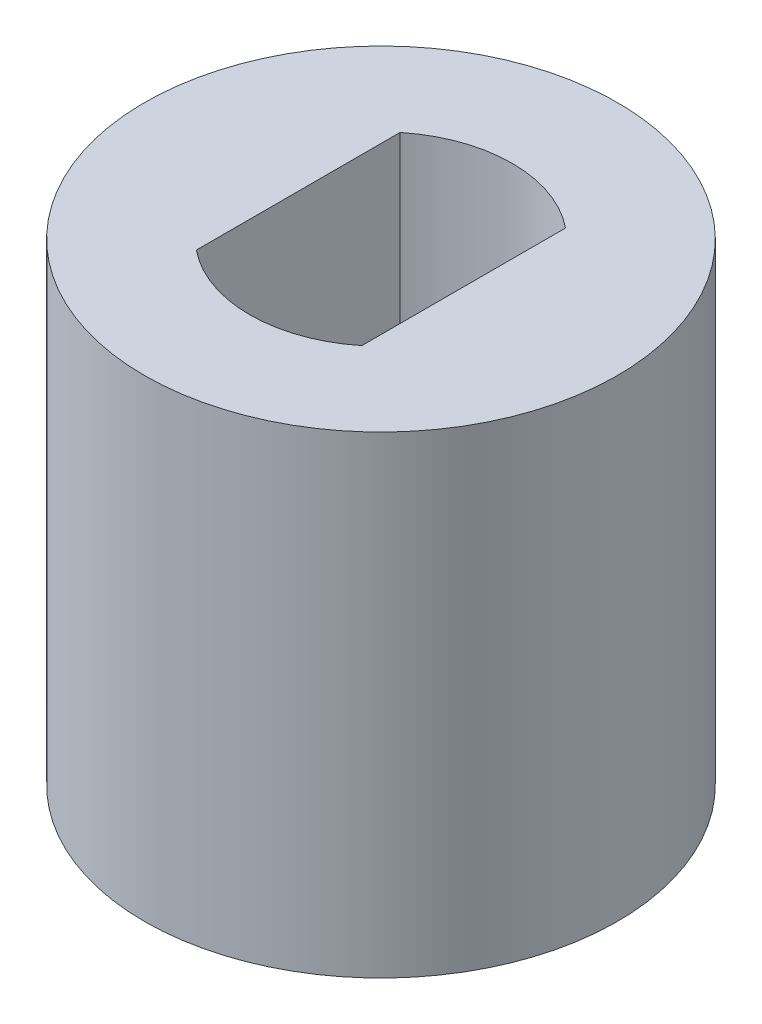
ISO-10303-21;
HEADER;
FILE_DESCRIPTION(('STEP AP214'),'2;1');
FILE_NAME('part.step','',(''),(''),'','','');
FILE_SCHEMA(('AUTOMOTIVE_DESIGN { 1 0 10303 214 1 1 1 1 }'));
ENDSEC;
DATA;
#1=APPLICATION_CONTEXT('core data for automotive mechanical design processes');
#2=APPLICATION_PROTOCOL_DEFINITION('international standard','automotive_design',2000,#1);
#3=PRODUCT_CONTEXT('',#1,'mechanical');
#4=PRODUCT('Part','Part','',(#3));
#5=PRODUCT_RELATED_PRODUCT_CATEGORY('part','',(#4));
#6=PRODUCT_DEFINITION_FORMATION('','',#4);
#7=PRODUCT_DEFINITION_CONTEXT('part definition',#1,'design');
#8=PRODUCT_DEFINITION('design','',#6,#7);
#9=PRODUCT_DEFINITION_SHAPE('','',#8);
#10=(LENGTH_UNIT() NAMED_UNIT(*) SI_UNIT(.MILLI.,.METRE.));
#11=(NAMED_UNIT(*) PLANE_ANGLE_UNIT() SI_UNIT($,.RADIAN.));
#12=(NAMED_UNIT(*) SI_UNIT($,.STERADIAN.) SOLID_ANGLE_UNIT());
#13=UNCERTAINTY_MEASURE_WITH_UNIT(LENGTH_MEASURE(1.E-05),#10,'distance_accuracy_value','');
#14=(GEOMETRIC_REPRESENTATION_CONTEXT(3) GLOBAL_UNCERTAINTY_ASSIGNED_CONTEXT((#13)) GLOBAL_UNIT_ASSIGNED_CONTEXT((#10,
#11,#12)) REPRESENTATION_CONTEXT('',''));
#15=CARTESIAN_POINT('',(0.,0.,0.));
#16=DIRECTION('',(0.,0.,1.));
#17=DIRECTION('',(1.,0.,0.));
#18=AXIS2_PLACEMENT_3D('',#15,#16,#17);
#19=CARTESIAN_POINT('',(0.,10.,0.));
#20=DIRECTION('',(0.,1.,0.));
#21=DIRECTION('',(0.,0.,1.));
#22=AXIS2_PLACEMENT_3D('',#19,#20,#21);
#23=PLANE('',#22);
#24=CARTESIAN_POINT('',(0.,10.,0.));
#25=DIRECTION('',(0.,1.,0.));
#26=DIRECTION('',(0.,0.,1.));
#27=AXIS2_PLACEMENT_3D('',#24,#25,#26);
#28=CIRCLE('',#27,5.);
#29=CARTESIAN_POINT('',(0.,10.,5.));
#30=VERTEX_POINT('',#29);
#31=EDGE_CURVE('E11',#30,#30,#28,.T.);
#32=ORIENTED_EDGE('',*,*,#31,.T.);
#33=EDGE_LOOP('',(#32));
#34=FACE_BOUND('',#33,.T.);
#35=DIRECTION('',(0.,0.,1.));
#36=VECTOR('',#35,1.);
#37=CARTESIAN_POINT('',(-1.75,10.,-2.15363065542818));
#38=LINE('',#37,#36);
#39=CARTESIAN_POINT('',(-1.75,10.,-2.15363065542818));
#40=VERTEX_POINT('',#39);
#41=CARTESIAN_POINT('',(-1.75,10.,2.15363065542818));
#42=VERTEX_POINT('',#41);
#43=EDGE_CURVE('E90',#40,#42,#38,.T.);
#44=ORIENTED_EDGE('',*,*,#43,.F.);
#45=CARTESIAN_POINT('',(0.,10.,0.));
#46=DIRECTION('',(0.,1.,0.));
#47=DIRECTION('',(0.,0.,1.));
#48=AXIS2_PLACEMENT_3D('',#45,#46,#47);
#49=CIRCLE('',#48,2.775);
#50=CARTESIAN_POINT('',(1.75,10.,-2.15363065542818));
#51=VERTEX_POINT('',#50);
#52=EDGE_CURVE('E81',#51,#40,#49,.T.);
#53=ORIENTED_EDGE('',*,*,#52,.F.);
#54=DIRECTION('',(0.,0.,-1.));
#55=VECTOR('',#54,1.);
#56=CARTESIAN_POINT('',(1.75,10.,-2.15363065542818));
#57=LINE('',#56,#55);
#58=CARTESIAN_POINT('',(1.75,10.,2.15363065542818));
#59=VERTEX_POINT('',#58);
#60=EDGE_CURVE('E106',#59,#51,#57,.T.);
#61=ORIENTED_EDGE('',*,*,#60,.F.);
#62=CARTESIAN_POINT('',(0.,10.,0.));
#63=DIRECTION('',(0.,1.,0.));
#64=DIRECTION('',(0.,0.,1.));
#65=AXIS2_PLACEMENT_3D('',#62,#63,#64);
#66=CIRCLE('',#65,2.775);
#67=EDGE_CURVE('E102',#42,#59,#66,.T.);
#68=ORIENTED_EDGE('',*,*,#67,.F.);
#69=EDGE_LOOP('',(#44,#53,#61,#68));
#70=FACE_BOUND('',#69,.T.);
#71=ADVANCED_FACE('F39',(#34,#70),#23,.T.);
#72=CARTESIAN_POINT('',(0.,0.,0.));
#73=DIRECTION('',(0.,1.,0.));
#74=DIRECTION('',(0.,0.,1.));
#75=AXIS2_PLACEMENT_3D('',#72,#73,#74);
#76=PLANE('',#75);
#77=CARTESIAN_POINT('',(0.,0.,0.));
#78=DIRECTION('',(0.,1.,0.));
#79=DIRECTION('',(0.,0.,1.));
#80=AXIS2_PLACEMENT_3D('',#77,#78,#79);
#81=CIRCLE('',#80,5.);
#82=CARTESIAN_POINT('',(0.,0.,5.));
#83=VERTEX_POINT('',#82);
#84=EDGE_CURVE('E43',#83,#83,#81,.T.);
#85=ORIENTED_EDGE('',*,*,#84,.F.);
#86=EDGE_LOOP('',(#85));
#87=FACE_BOUND('',#86,.T.);
#88=CARTESIAN_POINT('',(0.,0.,0.));
#89=DIRECTION('',(0.,1.,0.));
#90=DIRECTION('',(0.,0.,1.));
#91=AXIS2_PLACEMENT_3D('',#88,#89,#90);
#92=CIRCLE('',#91,2.775);
#93=CARTESIAN_POINT('',(1.75,0.,-2.15363065542818));
#94=VERTEX_POINT('',#93);
#95=CARTESIAN_POINT('',(-1.75,0.,-2.15363065542818));
#96=VERTEX_POINT('',#95);
#97=EDGE_CURVE('E63',#94,#96,#92,.T.);
#98=ORIENTED_EDGE('',*,*,#97,.T.);
#99=DIRECTION('',(0.,0.,1.));
#100=VECTOR('',#99,1.);
#101=CARTESIAN_POINT('',(-1.75,0.,-2.15363065542818));
#102=LINE('',#101,#100);
#103=CARTESIAN_POINT('',(-1.75,0.,2.15363065542818));
#104=VERTEX_POINT('',#103);
#105=EDGE_CURVE('E97',#96,#104,#102,.T.);
#106=ORIENTED_EDGE('',*,*,#105,.T.);
#107=CARTESIAN_POINT('',(0.,0.,0.));
#108=DIRECTION('',(0.,1.,0.));
#109=DIRECTION('',(0.,0.,1.));
#110=AXIS2_PLACEMENT_3D('',#107,#108,#109);
#111=CIRCLE('',#110,2.775);
#112=CARTESIAN_POINT('',(1.75,0.,2.15363065542818));
#113=VERTEX_POINT('',#112);
#114=EDGE_CURVE('E115',#104,#113,#111,.T.);
#115=ORIENTED_EDGE('',*,*,#114,.T.);
#116=DIRECTION('',(0.,0.,-1.));
#117=VECTOR('',#116,1.);
#118=CARTESIAN_POINT('',(1.75,0.,-2.15363065542818));
#119=LINE('',#118,#117);
#120=EDGE_CURVE('E91',#113,#94,#119,.T.);
#121=ORIENTED_EDGE('',*,*,#120,.T.);
#122=EDGE_LOOP('',(#98,#106,#115,#121));
#123=FACE_BOUND('',#122,.T.);
#124=ADVANCED_FACE('F131',(#87,#123),#76,.F.);
#125=CARTESIAN_POINT('',(0.,10.,0.));
#126=DIRECTION('',(0.,-1.,0.));
#127=DIRECTION('',(0.,0.,-1.));
#128=AXIS2_PLACEMENT_3D('',#125,#126,#127);
#129=CYLINDRICAL_SURFACE('',#128,5.);
#130=ORIENTED_EDGE('',*,*,#31,.F.);
#131=EDGE_LOOP('',(#130));
#132=FACE_BOUND('',#131,.T.);
#133=ORIENTED_EDGE('',*,*,#84,.T.);
#134=EDGE_LOOP('',(#133));
#135=FACE_BOUND('',#134,.T.);
#136=ADVANCED_FACE('F41',(#132,#135),#129,.T.);
#137=CARTESIAN_POINT('',(0.,10.,0.));
#138=DIRECTION('',(0.,-1.,0.));
#139=DIRECTION('',(0.,0.,-1.));
#140=AXIS2_PLACEMENT_3D('',#137,#138,#139);
#141=CYLINDRICAL_SURFACE('',#140,2.775);
#142=ORIENTED_EDGE('',*,*,#97,.F.);
#143=DIRECTION('',(0.,-1.,0.));
#144=VECTOR('',#143,1.);
#145=CARTESIAN_POINT('',(1.75,10.,-2.15363065542818));
#146=LINE('',#145,#144);
#147=EDGE_CURVE('E85',#51,#94,#146,.T.);
#148=ORIENTED_EDGE('',*,*,#147,.F.);
#149=ORIENTED_EDGE('',*,*,#52,.T.);
#150=DIRECTION('',(0.,-1.,0.));
#151=VECTOR('',#150,1.);
#152=CARTESIAN_POINT('',(-1.75,10.,-2.15363065542818));
#153=LINE('',#152,#151);
#154=EDGE_CURVE('E84',#40,#96,#153,.T.);
#155=ORIENTED_EDGE('',*,*,#154,.T.);
#156=EDGE_LOOP('',(#142,#148,#149,#155));
#157=FACE_BOUND('',#156,.T.);
#158=ADVANCED_FACE('F83',(#157),#141,.F.);
#159=CARTESIAN_POINT('',(-1.75,10.,-2.15363065542818));
#160=DIRECTION('',(1.,0.,0.));
#161=DIRECTION('',(0.,0.,-1.));
#162=AXIS2_PLACEMENT_3D('',#159,#160,#161);
#163=PLANE('',#162);
#164=ORIENTED_EDGE('',*,*,#105,.F.);
#165=ORIENTED_EDGE('',*,*,#154,.F.);
#166=ORIENTED_EDGE('',*,*,#43,.T.);
#167=DIRECTION('',(0.,-1.,0.));
#168=VECTOR('',#167,1.);
#169=CARTESIAN_POINT('',(-1.75,10.,2.15363065542818));
#170=LINE('',#169,#168);
#171=EDGE_CURVE('E99',#42,#104,#170,.T.);
#172=ORIENTED_EDGE('',*,*,#171,.T.);
#173=EDGE_LOOP('',(#164,#165,#166,#172));
#174=FACE_BOUND('',#173,.T.);
#175=ADVANCED_FACE('F94',(#174),#163,.T.);
#176=CARTESIAN_POINT('',(0.,10.,0.));
#177=DIRECTION('',(0.,-1.,0.));
#178=DIRECTION('',(0.,0.,-1.));
#179=AXIS2_PLACEMENT_3D('',#176,#177,#178);
#180=CYLINDRICAL_SURFACE('',#179,2.775);
#181=ORIENTED_EDGE('',*,*,#114,.F.);
#182=ORIENTED_EDGE('',*,*,#171,.F.);
#183=ORIENTED_EDGE('',*,*,#67,.T.);
#184=DIRECTION('',(0.,-1.,0.));
#185=VECTOR('',#184,1.);
#186=CARTESIAN_POINT('',(1.75,10.,2.15363065542818));
#187=LINE('',#186,#185);
#188=EDGE_CURVE('E55',#59,#113,#187,.T.);
#189=ORIENTED_EDGE('',*,*,#188,.T.);
#190=EDGE_LOOP('',(#181,#182,#183,#189));
#191=FACE_BOUND('',#190,.T.);
#192=ADVANCED_FACE('F129',(#191),#180,.F.);
#193=CARTESIAN_POINT('',(1.75,10.,-2.15363065542818));
#194=DIRECTION('',(-1.,0.,0.));
#195=DIRECTION('',(0.,0.,1.));
#196=AXIS2_PLACEMENT_3D('',#193,#194,#195);
#197=PLANE('',#196);
#198=ORIENTED_EDGE('',*,*,#120,.F.);
#199=ORIENTED_EDGE('',*,*,#188,.F.);
#200=ORIENTED_EDGE('',*,*,#60,.T.);
#201=ORIENTED_EDGE('',*,*,#147,.T.);
#202=EDGE_LOOP('',(#198,#199,#200,#201));
#203=FACE_BOUND('',#202,.T.);
#204=ADVANCED_FACE('F132',(#203),#197,.T.);
#205=CLOSED_SHELL('',(#71,#124,#136,#158,#175,#192,#204));
#206=MANIFOLD_SOLID_BREP('B2',#205);
#207=ADVANCED_BREP_SHAPE_REPRESENTATION('',(#18,#206),#14);
#208=SHAPE_DEFINITION_REPRESENTATION(#9,#207);
ENDSEC;
END-ISO-10303-21;
